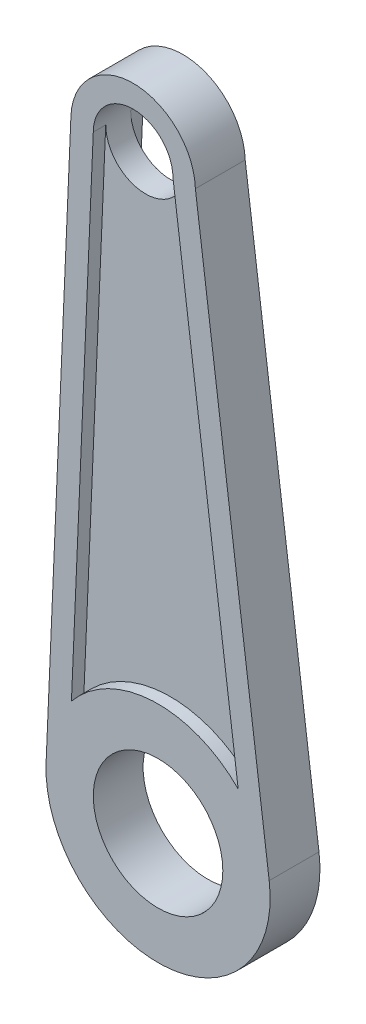
ISO-10303-21;
HEADER;
FILE_DESCRIPTION(('STEP AP214'),'2;1');
FILE_NAME('part.step','',(''),(''),'','','');
FILE_SCHEMA(('AUTOMOTIVE_DESIGN { 1 0 10303 214 1 1 1 1 }'));
ENDSEC;
DATA;
#1=APPLICATION_CONTEXT('core data for automotive mechanical design processes');
#2=APPLICATION_PROTOCOL_DEFINITION('international standard','automotive_design',2000,#1);
#3=PRODUCT_CONTEXT('',#1,'mechanical');
#4=PRODUCT('Part','Part','',(#3));
#5=PRODUCT_RELATED_PRODUCT_CATEGORY('part','',(#4));
#6=PRODUCT_DEFINITION_FORMATION('','',#4);
#7=PRODUCT_DEFINITION_CONTEXT('part definition',#1,'design');
#8=PRODUCT_DEFINITION('design','',#6,#7);
#9=PRODUCT_DEFINITION_SHAPE('','',#8);
#10=(LENGTH_UNIT() NAMED_UNIT(*) SI_UNIT(.MILLI.,.METRE.));
#11=(NAMED_UNIT(*) PLANE_ANGLE_UNIT() SI_UNIT($,.RADIAN.));
#12=(NAMED_UNIT(*) SI_UNIT($,.STERADIAN.) SOLID_ANGLE_UNIT());
#13=UNCERTAINTY_MEASURE_WITH_UNIT(LENGTH_MEASURE(1.E-05),#10,'distance_accuracy_value','');
#14=(GEOMETRIC_REPRESENTATION_CONTEXT(3) GLOBAL_UNCERTAINTY_ASSIGNED_CONTEXT((#13)) GLOBAL_UNIT_ASSIGNED_CONTEXT((#10,
#11,#12)) REPRESENTATION_CONTEXT('',''));
#15=CARTESIAN_POINT('',(0.,0.,0.));
#16=DIRECTION('',(0.,0.,1.));
#17=DIRECTION('',(1.,0.,0.));
#18=AXIS2_PLACEMENT_3D('',#15,#16,#17);
#19=CARTESIAN_POINT('',(14.5457596396694,1.90941631755371,10.));
#20=DIRECTION('',(0.991493917899704,0.130153028270168,0.));
#21=DIRECTION('',(-0.130153028270168,0.991493917899704,0.));
#22=AXIS2_PLACEMENT_3D('',#19,#20,#21);
#23=PLANE('',#22);
#24=DIRECTION('',(0.130153028270168,-0.991493917899704,0.));
#25=VECTOR('',#24,1.);
#26=CARTESIAN_POINT('',(14.5457596396694,1.90941631755371,2.5));
#27=LINE('',#26,#25);
#28=CARTESIAN_POINT('',(8.,51.7744172093779,2.5));
#29=VERTEX_POINT('',#28);
#30=CARTESIAN_POINT('',(21.0831502483952,-47.8918300586089,2.5));
#31=VERTEX_POINT('',#30);
#32=EDGE_CURVE('E235',#29,#31,#27,.T.);
#33=ORIENTED_EDGE('',*,*,#32,.F.);
#34=DIRECTION('',(0.,0.,-1.));
#35=VECTOR('',#34,1.);
#36=CARTESIAN_POINT('',(8.,51.7744172093779,10.));
#37=LINE('',#36,#35);
#38=CARTESIAN_POINT('',(8.,51.7744172093779,0.));
#39=VERTEX_POINT('',#38);
#40=EDGE_CURVE('E101',#29,#39,#37,.T.);
#41=ORIENTED_EDGE('',*,*,#40,.T.);
#42=DIRECTION('',(0.130153028270168,-0.991493917899704,0.));
#43=VECTOR('',#42,1.);
#44=CARTESIAN_POINT('',(14.5457596396694,1.90941631755371,0.));
#45=LINE('',#44,#43);
#46=CARTESIAN_POINT('',(21.0831502483952,-47.8918300586089,0.));
#47=VERTEX_POINT('',#46);
#48=EDGE_CURVE('E182',#39,#47,#45,.T.);
#49=ORIENTED_EDGE('',*,*,#48,.T.);
#50=DIRECTION('',(0.,0.,-1.));
#51=VECTOR('',#50,1.);
#52=CARTESIAN_POINT('',(21.0831502483952,-47.8918300586089,10.));
#53=LINE('',#52,#51);
#54=EDGE_CURVE('E51',#31,#47,#53,.T.);
#55=ORIENTED_EDGE('',*,*,#54,.F.);
#56=EDGE_LOOP('',(#33,#41,#49,#55));
#57=FACE_BOUND('',#56,.T.);
#58=ADVANCED_FACE('F41',(#57),#23,.F.);
#59=CARTESIAN_POINT('',(5.00208599758232,-63.6287094367204,10.));
#60=DIRECTION('',(0.,0.,-1.));
#61=DIRECTION('',(-1.,0.,0.));
#62=AXIS2_PLACEMENT_3D('',#59,#60,#61);
#63=CYLINDRICAL_SURFACE('',#62,22.5);
#64=CARTESIAN_POINT('',(5.00208599758232,-63.6287094367204,2.5));
#65=DIRECTION('',(0.,0.,1.));
#66=DIRECTION('',(1.,0.,0.));
#67=AXIS2_PLACEMENT_3D('',#64,#65,#66);
#68=CIRCLE('',#67,22.5);
#69=CARTESIAN_POINT('',(-12.3878341728911,-49.3514311083917,2.5));
#70=VERTEX_POINT('',#69);
#71=EDGE_CURVE('E228',#31,#70,#68,.T.);
#72=ORIENTED_EDGE('',*,*,#71,.F.);
#73=ORIENTED_EDGE('',*,*,#54,.T.);
#74=CARTESIAN_POINT('',(5.00208599758232,-63.6287094367204,0.));
#75=DIRECTION('',(0.,0.,1.));
#76=DIRECTION('',(1.,0.,0.));
#77=AXIS2_PLACEMENT_3D('',#74,#75,#76);
#78=CIRCLE('',#77,22.5);
#79=CARTESIAN_POINT('',(-12.3878341728911,-49.3514311083917,0.));
#80=VERTEX_POINT('',#79);
#81=EDGE_CURVE('E185',#47,#80,#78,.T.);
#82=ORIENTED_EDGE('',*,*,#81,.T.);
#83=DIRECTION('',(0.,0.,-1.));
#84=VECTOR('',#83,1.);
#85=CARTESIAN_POINT('',(-12.3878341728911,-49.3514311083917,10.));
#86=LINE('',#85,#84);
#87=EDGE_CURVE('E148',#70,#80,#86,.T.);
#88=ORIENTED_EDGE('',*,*,#87,.F.);
#89=EDGE_LOOP('',(#72,#73,#82,#88));
#90=FACE_BOUND('',#89,.T.);
#91=ADVANCED_FACE('F224',(#90),#63,.T.);
#92=CARTESIAN_POINT('',(-10.2272289941798,0.443757808919749,10.));
#93=DIRECTION('',(0.99905998807736,-0.0433490510030528,0.));
#94=DIRECTION('',(0.0433490510030529,0.99905998807736,0.));
#95=AXIS2_PLACEMENT_3D('',#92,#93,#94);
#96=PLANE('',#95);
#97=DIRECTION('',(0.,0.,-1.));
#98=VECTOR('',#97,1.);
#99=CARTESIAN_POINT('',(-8.,51.7744172093779,10.));
#100=LINE('',#99,#98);
#101=CARTESIAN_POINT('',(-8.,51.7744172093779,2.5));
#102=VERTEX_POINT('',#101);
#103=CARTESIAN_POINT('',(-8.,51.7744172093779,0.));
#104=VERTEX_POINT('',#103);
#105=EDGE_CURVE('E200',#102,#104,#100,.T.);
#106=ORIENTED_EDGE('',*,*,#105,.F.);
#107=DIRECTION('',(-0.0433490510030529,-0.99905998807736,0.));
#108=VECTOR('',#107,1.);
#109=CARTESIAN_POINT('',(-10.2272289941798,0.443757808919749,2.5));
#110=LINE('',#109,#108);
#111=EDGE_CURVE('E270',#102,#70,#110,.T.);
#112=ORIENTED_EDGE('',*,*,#111,.T.);
#113=ORIENTED_EDGE('',*,*,#87,.T.);
#114=DIRECTION('',(-0.0433490510030529,-0.99905998807736,0.));
#115=VECTOR('',#114,1.);
#116=CARTESIAN_POINT('',(-10.2272289941798,0.443757808919749,0.));
#117=LINE('',#116,#115);
#118=EDGE_CURVE('E189',#104,#80,#117,.T.);
#119=ORIENTED_EDGE('',*,*,#118,.F.);
#120=EDGE_LOOP('',(#106,#112,#113,#119));
#121=FACE_BOUND('',#120,.T.);
#122=ADVANCED_FACE('F242',(#121),#96,.T.);
#123=CARTESIAN_POINT('',(8.,51.7744172093779,10.));
#124=VERTEX_POINT('',#123);
#125=CARTESIAN_POINT('',(8.,51.7744172093779,7.5));
#126=VERTEX_POINT('',#125);
#127=EDGE_CURVE('E68',#124,#126,#37,.T.);
#128=ORIENTED_EDGE('',*,*,#127,.T.);
#129=DIRECTION('',(0.130153028270168,-0.991493917899704,0.));
#130=VECTOR('',#129,1.);
#131=CARTESIAN_POINT('',(14.5457596396694,1.90941631755371,7.5));
#132=LINE('',#131,#130);
#133=CARTESIAN_POINT('',(21.0831502483952,-47.8918300586089,7.5));
#134=VERTEX_POINT('',#133);
#135=EDGE_CURVE('E257',#126,#134,#132,.T.);
#136=ORIENTED_EDGE('',*,*,#135,.T.);
#137=CARTESIAN_POINT('',(21.0831502483952,-47.8918300586089,10.));
#138=VERTEX_POINT('',#137);
#139=EDGE_CURVE('E11',#138,#134,#53,.T.);
#140=ORIENTED_EDGE('',*,*,#139,.F.);
#141=DIRECTION('',(0.130153028270168,-0.991493917899704,0.));
#142=VECTOR('',#141,1.);
#143=CARTESIAN_POINT('',(14.5457596396694,1.90941631755371,10.));
#144=LINE('',#143,#142);
#145=EDGE_CURVE('E134',#124,#138,#144,.T.);
#146=ORIENTED_EDGE('',*,*,#145,.F.);
#147=EDGE_LOOP('',(#128,#136,#140,#146));
#148=FACE_BOUND('',#147,.T.);
#149=ADVANCED_FACE('F238',(#148),#23,.F.);
#150=ORIENTED_EDGE('',*,*,#139,.T.);
#151=CARTESIAN_POINT('',(5.00208599758232,-63.6287094367204,7.5));
#152=DIRECTION('',(0.,0.,1.));
#153=DIRECTION('',(1.,0.,0.));
#154=AXIS2_PLACEMENT_3D('',#151,#152,#153);
#155=CIRCLE('',#154,22.5);
#156=CARTESIAN_POINT('',(-12.3878341728911,-49.3514311083917,7.5));
#157=VERTEX_POINT('',#156);
#158=EDGE_CURVE('E144',#134,#157,#155,.T.);
#159=ORIENTED_EDGE('',*,*,#158,.T.);
#160=CARTESIAN_POINT('',(-12.3878341728911,-49.3514311083917,10.));
#161=VERTEX_POINT('',#160);
#162=EDGE_CURVE('E141',#161,#157,#86,.T.);
#163=ORIENTED_EDGE('',*,*,#162,.F.);
#164=CARTESIAN_POINT('',(5.00208599758232,-63.6287094367204,10.));
#165=DIRECTION('',(0.,0.,1.));
#166=DIRECTION('',(1.,0.,0.));
#167=AXIS2_PLACEMENT_3D('',#164,#165,#166);
#168=CIRCLE('',#167,22.5);
#169=EDGE_CURVE('E128',#138,#161,#168,.T.);
#170=ORIENTED_EDGE('',*,*,#169,.F.);
#171=EDGE_LOOP('',(#150,#159,#163,#170));
#172=FACE_BOUND('',#171,.T.);
#173=ADVANCED_FACE('F142',(#172),#63,.T.);
#174=DIRECTION('',(-0.0433490510030529,-0.99905998807736,0.));
#175=VECTOR('',#174,1.);
#176=CARTESIAN_POINT('',(-10.2272289941798,0.443757808919749,7.5));
#177=LINE('',#176,#175);
#178=CARTESIAN_POINT('',(-8.,51.7744172093779,7.5));
#179=VERTEX_POINT('',#178);
#180=EDGE_CURVE('E166',#179,#157,#177,.T.);
#181=ORIENTED_EDGE('',*,*,#180,.F.);
#182=CARTESIAN_POINT('',(-8.,51.7744172093779,10.));
#183=VERTEX_POINT('',#182);
#184=EDGE_CURVE('E152',#183,#179,#100,.T.);
#185=ORIENTED_EDGE('',*,*,#184,.F.);
#186=DIRECTION('',(-0.0433490510030529,-0.99905998807736,0.));
#187=VECTOR('',#186,1.);
#188=CARTESIAN_POINT('',(-10.2272289941798,0.443757808919749,10.));
#189=LINE('',#188,#187);
#190=EDGE_CURVE('E133',#183,#161,#189,.T.);
#191=ORIENTED_EDGE('',*,*,#190,.T.);
#192=ORIENTED_EDGE('',*,*,#162,.T.);
#193=EDGE_LOOP('',(#181,#185,#191,#192));
#194=FACE_BOUND('',#193,.T.);
#195=ADVANCED_FACE('F150',(#194),#96,.T.);
#196=CARTESIAN_POINT('',(19.0149383990504,2.4960837079562,10.));
#197=DIRECTION('',(0.991493917899704,0.130153028270168,0.));
#198=DIRECTION('',(-0.130153028270168,0.991493917899704,0.));
#199=AXIS2_PLACEMENT_3D('',#196,#197,#198);
#200=PLANE('',#199);
#201=DIRECTION('',(0.130153028270168,-0.991493917899704,0.));
#202=VECTOR('',#201,1.);
#203=CARTESIAN_POINT('',(19.0149383990504,2.4960837079562,0.));
#204=LINE('',#203,#202);
#205=CARTESIAN_POINT('',(12.4935711762877,52.1752653889079,0.));
#206=VERTEX_POINT('',#205);
#207=CARTESIAN_POINT('',(27.3106991503257,-60.7002663006416,0.));
#208=VERTEX_POINT('',#207);
#209=EDGE_CURVE('E165',#206,#208,#204,.T.);
#210=ORIENTED_EDGE('',*,*,#209,.F.);
#211=DIRECTION('',(0.,0.,-1.));
#212=VECTOR('',#211,1.);
#213=CARTESIAN_POINT('',(12.4935711762877,52.1752653889079,10.));
#214=LINE('',#213,#212);
#215=CARTESIAN_POINT('',(12.4935711762877,52.1752653889079,10.));
#216=VERTEX_POINT('',#215);
#217=EDGE_CURVE('E45',#216,#206,#214,.T.);
#218=ORIENTED_EDGE('',*,*,#217,.F.);
#219=DIRECTION('',(0.130153028270168,-0.991493917899704,0.));
#220=VECTOR('',#219,1.);
#221=CARTESIAN_POINT('',(19.0149383990504,2.4960837079562,10.));
#222=LINE('',#221,#220);
#223=CARTESIAN_POINT('',(27.3106991503257,-60.7002663006416,10.));
#224=VERTEX_POINT('',#223);
#225=EDGE_CURVE('E285',#216,#224,#222,.T.);
#226=ORIENTED_EDGE('',*,*,#225,.T.);
#227=DIRECTION('',(0.,0.,-1.));
#228=VECTOR('',#227,1.);
#229=CARTESIAN_POINT('',(27.3106991503257,-60.7002663006416,10.));
#230=LINE('',#229,#228);
#231=EDGE_CURVE('E157',#224,#208,#230,.T.);
#232=ORIENTED_EDGE('',*,*,#231,.T.);
#233=EDGE_LOOP('',(#210,#218,#226,#232));
#234=FACE_BOUND('',#233,.T.);
#235=ADVANCED_FACE('F324',(#234),#200,.T.);
#236=CARTESIAN_POINT('',(0.,51.7744172093779,10.));
#237=DIRECTION('',(0.,0.,-1.));
#238=DIRECTION('',(-1.,0.,0.));
#239=AXIS2_PLACEMENT_3D('',#236,#237,#238);
#240=CYLINDRICAL_SURFACE('',#239,12.5);
#241=CARTESIAN_POINT('',(0.,51.7744172093779,0.));
#242=DIRECTION('',(0.,0.,1.));
#243=DIRECTION('',(1.,0.,0.));
#244=AXIS2_PLACEMENT_3D('',#241,#242,#243);
#245=CIRCLE('',#244,12.5);
#246=CARTESIAN_POINT('',(-12.488249850967,52.316280346916,0.));
#247=VERTEX_POINT('',#246);
#248=EDGE_CURVE('E170',#206,#247,#245,.T.);
#249=ORIENTED_EDGE('',*,*,#248,.T.);
#250=DIRECTION('',(0.,0.,-1.));
#251=VECTOR('',#250,1.);
#252=CARTESIAN_POINT('',(-12.488249850967,52.316280346916,10.));
#253=LINE('',#252,#251);
#254=CARTESIAN_POINT('',(-12.488249850967,52.316280346916,10.));
#255=VERTEX_POINT('',#254);
#256=EDGE_CURVE('E208',#255,#247,#253,.T.);
#257=ORIENTED_EDGE('',*,*,#256,.F.);
#258=CARTESIAN_POINT('',(0.,51.7744172093779,10.));
#259=DIRECTION('',(0.,0.,1.));
#260=DIRECTION('',(1.,0.,0.));
#261=AXIS2_PLACEMENT_3D('',#258,#259,#260);
#262=CIRCLE('',#261,12.5);
#263=EDGE_CURVE('E288',#216,#255,#262,.T.);
#264=ORIENTED_EDGE('',*,*,#263,.F.);
#265=ORIENTED_EDGE('',*,*,#217,.T.);
#266=EDGE_LOOP('',(#249,#257,#264,#265));
#267=FACE_BOUND('',#266,.T.);
#268=ADVANCED_FACE('F328',(#267),#240,.T.);
#269=CARTESIAN_POINT('',(-14.7305119669297,0.63915452743171,10.));
#270=DIRECTION('',(0.99905998807736,-0.0433490510030528,0.));
#271=DIRECTION('',(0.0433490510030528,0.99905998807736,0.));
#272=AXIS2_PLACEMENT_3D('',#269,#270,#271);
#273=PLANE('',#272);
#274=DIRECTION('',(-0.0433490510030528,-0.99905998807736,0.));
#275=VECTOR('',#274,1.);
#276=CARTESIAN_POINT('',(-14.7305119669297,0.63915452743171,0.));
#277=LINE('',#276,#275);
#278=CARTESIAN_POINT('',(-17.4767637341583,-62.6533557891517,0.));
#279=VERTEX_POINT('',#278);
#280=EDGE_CURVE('E174',#247,#279,#277,.T.);
#281=ORIENTED_EDGE('',*,*,#280,.T.);
#282=DIRECTION('',(0.,0.,-1.));
#283=VECTOR('',#282,1.);
#284=CARTESIAN_POINT('',(-17.4767637341583,-62.6533557891517,10.));
#285=LINE('',#284,#283);
#286=CARTESIAN_POINT('',(-17.4767637341583,-62.6533557891517,10.));
#287=VERTEX_POINT('',#286);
#288=EDGE_CURVE('E205',#287,#279,#285,.T.);
#289=ORIENTED_EDGE('',*,*,#288,.F.);
#290=DIRECTION('',(-0.0433490510030528,-0.99905998807736,0.));
#291=VECTOR('',#290,1.);
#292=CARTESIAN_POINT('',(-14.7305119669297,0.63915452743171,10.));
#293=LINE('',#292,#291);
#294=EDGE_CURVE('E292',#255,#287,#293,.T.);
#295=ORIENTED_EDGE('',*,*,#294,.F.);
#296=ORIENTED_EDGE('',*,*,#256,.T.);
#297=EDGE_LOOP('',(#281,#289,#295,#296));
#298=FACE_BOUND('',#297,.T.);
#299=ADVANCED_FACE('F332',(#298),#273,.F.);
#300=CARTESIAN_POINT('',(5.00208599758232,-63.6287094367204,10.));
#301=DIRECTION('',(0.,0.,-1.));
#302=DIRECTION('',(-1.,0.,0.));
#303=AXIS2_PLACEMENT_3D('',#300,#301,#302);
#304=CYLINDRICAL_SURFACE('',#303,22.5);
#305=CARTESIAN_POINT('',(5.00208599758232,-63.6287094367204,0.));
#306=DIRECTION('',(0.,0.,1.));
#307=DIRECTION('',(1.,0.,0.));
#308=AXIS2_PLACEMENT_3D('',#305,#306,#307);
#309=CIRCLE('',#308,22.5);
#310=EDGE_CURVE('E178',#279,#208,#309,.T.);
#311=ORIENTED_EDGE('',*,*,#310,.T.);
#312=ORIENTED_EDGE('',*,*,#231,.F.);
#313=CARTESIAN_POINT('',(5.00208599758232,-63.6287094367204,10.));
#314=DIRECTION('',(0.,0.,1.));
#315=DIRECTION('',(1.,0.,0.));
#316=AXIS2_PLACEMENT_3D('',#313,#314,#315);
#317=CIRCLE('',#316,22.5);
#318=EDGE_CURVE('E296',#287,#224,#317,.T.);
#319=ORIENTED_EDGE('',*,*,#318,.F.);
#320=ORIENTED_EDGE('',*,*,#288,.T.);
#321=EDGE_LOOP('',(#311,#312,#319,#320));
#322=FACE_BOUND('',#321,.T.);
#323=ADVANCED_FACE('F336',(#322),#304,.T.);
#324=CARTESIAN_POINT('',(5.00208599758232,-63.6287094367204,10.));
#325=DIRECTION('',(0.,0.,-1.));
#326=DIRECTION('',(-1.,0.,0.));
#327=AXIS2_PLACEMENT_3D('',#324,#325,#326);
#328=CYLINDRICAL_SURFACE('',#327,13.);
#329=CARTESIAN_POINT('',(5.00208599758232,-63.6287094367204,10.));
#330=DIRECTION('',(0.,0.,1.));
#331=DIRECTION('',(1.,0.,0.));
#332=AXIS2_PLACEMENT_3D('',#329,#330,#331);
#333=CIRCLE('',#332,13.);
#334=CARTESIAN_POINT('',(18.0020859975823,-63.6287094367204,10.));
#335=VERTEX_POINT('',#334);
#336=EDGE_CURVE('E197',#335,#335,#333,.T.);
#337=ORIENTED_EDGE('',*,*,#336,.T.);
#338=EDGE_LOOP('',(#337));
#339=FACE_BOUND('',#338,.T.);
#340=CARTESIAN_POINT('',(5.00208599758232,-63.6287094367204,0.));
#341=DIRECTION('',(0.,0.,1.));
#342=DIRECTION('',(1.,0.,0.));
#343=AXIS2_PLACEMENT_3D('',#340,#341,#342);
#344=CIRCLE('',#343,13.);
#345=CARTESIAN_POINT('',(18.0020859975823,-63.6287094367204,0.));
#346=VERTEX_POINT('',#345);
#347=EDGE_CURVE('E161',#346,#346,#344,.T.);
#348=ORIENTED_EDGE('',*,*,#347,.F.);
#349=EDGE_LOOP('',(#348));
#350=FACE_BOUND('',#349,.T.);
#351=ADVANCED_FACE('F43',(#339,#350),#328,.F.);
#352=CARTESIAN_POINT('',(0.,51.7744172093779,10.));
#353=DIRECTION('',(0.,0.,-1.));
#354=DIRECTION('',(-1.,0.,0.));
#355=AXIS2_PLACEMENT_3D('',#352,#353,#354);
#356=CYLINDRICAL_SURFACE('',#355,8.);
#357=ORIENTED_EDGE('',*,*,#40,.F.);
#358=CARTESIAN_POINT('',(0.,51.7744172093779,2.5));
#359=DIRECTION('',(0.,0.,1.));
#360=DIRECTION('',(1.,0.,0.));
#361=AXIS2_PLACEMENT_3D('',#358,#359,#360);
#362=CIRCLE('',#361,8.);
#363=EDGE_CURVE('E59',#102,#29,#362,.T.);
#364=ORIENTED_EDGE('',*,*,#363,.F.);
#365=ORIENTED_EDGE('',*,*,#105,.T.);
#366=CARTESIAN_POINT('',(0.,51.7744172093779,0.));
#367=DIRECTION('',(0.,0.,1.));
#368=DIRECTION('',(1.,0.,0.));
#369=AXIS2_PLACEMENT_3D('',#366,#367,#368);
#370=CIRCLE('',#369,8.);
#371=EDGE_CURVE('E193',#39,#104,#370,.T.);
#372=ORIENTED_EDGE('',*,*,#371,.F.);
#373=EDGE_LOOP('',(#357,#364,#365,#372));
#374=FACE_BOUND('',#373,.T.);
#375=CARTESIAN_POINT('',(0.,51.7744172093779,7.5));
#376=DIRECTION('',(0.,0.,1.));
#377=DIRECTION('',(1.,0.,0.));
#378=AXIS2_PLACEMENT_3D('',#375,#376,#377);
#379=CIRCLE('',#378,8.);
#380=EDGE_CURVE('E301',#179,#126,#379,.T.);
#381=ORIENTED_EDGE('',*,*,#380,.T.);
#382=ORIENTED_EDGE('',*,*,#127,.F.);
#383=CARTESIAN_POINT('',(0.,51.7744172093779,10.));
#384=DIRECTION('',(0.,0.,1.));
#385=DIRECTION('',(1.,0.,0.));
#386=AXIS2_PLACEMENT_3D('',#383,#384,#385);
#387=CIRCLE('',#386,8.);
#388=EDGE_CURVE('E154',#124,#183,#387,.T.);
#389=ORIENTED_EDGE('',*,*,#388,.T.);
#390=ORIENTED_EDGE('',*,*,#184,.T.);
#391=EDGE_LOOP('',(#381,#382,#389,#390));
#392=FACE_BOUND('',#391,.T.);
#393=ADVANCED_FACE('F307',(#374,#392),#356,.F.);
#394=CARTESIAN_POINT('',(0.,0.,10.));
#395=DIRECTION('',(0.,0.,1.));
#396=DIRECTION('',(1.,0.,0.));
#397=AXIS2_PLACEMENT_3D('',#394,#395,#396);
#398=PLANE('',#397);
#399=ORIENTED_EDGE('',*,*,#336,.F.);
#400=EDGE_LOOP('',(#399));
#401=FACE_BOUND('',#400,.T.);
#402=ORIENTED_EDGE('',*,*,#225,.F.);
#403=ORIENTED_EDGE('',*,*,#263,.T.);
#404=ORIENTED_EDGE('',*,*,#294,.T.);
#405=ORIENTED_EDGE('',*,*,#318,.T.);
#406=EDGE_LOOP('',(#402,#403,#404,#405));
#407=FACE_BOUND('',#406,.T.);
#408=ORIENTED_EDGE('',*,*,#145,.T.);
#409=ORIENTED_EDGE('',*,*,#169,.T.);
#410=ORIENTED_EDGE('',*,*,#190,.F.);
#411=ORIENTED_EDGE('',*,*,#388,.F.);
#412=EDGE_LOOP('',(#408,#409,#410,#411));
#413=FACE_BOUND('',#412,.T.);
#414=ADVANCED_FACE('F130',(#401,#407,#413),#398,.T.);
#415=CARTESIAN_POINT('',(0.,0.,0.));
#416=DIRECTION('',(0.,0.,1.));
#417=DIRECTION('',(1.,0.,0.));
#418=AXIS2_PLACEMENT_3D('',#415,#416,#417);
#419=PLANE('',#418);
#420=ORIENTED_EDGE('',*,*,#347,.T.);
#421=EDGE_LOOP('',(#420));
#422=FACE_BOUND('',#421,.T.);
#423=ORIENTED_EDGE('',*,*,#209,.T.);
#424=ORIENTED_EDGE('',*,*,#310,.F.);
#425=ORIENTED_EDGE('',*,*,#280,.F.);
#426=ORIENTED_EDGE('',*,*,#248,.F.);
#427=EDGE_LOOP('',(#423,#424,#425,#426));
#428=FACE_BOUND('',#427,.T.);
#429=ORIENTED_EDGE('',*,*,#48,.F.);
#430=ORIENTED_EDGE('',*,*,#371,.T.);
#431=ORIENTED_EDGE('',*,*,#118,.T.);
#432=ORIENTED_EDGE('',*,*,#81,.F.);
#433=EDGE_LOOP('',(#429,#430,#431,#432));
#434=FACE_BOUND('',#433,.T.);
#435=ADVANCED_FACE('F230',(#422,#428,#434),#419,.F.);
#436=CARTESIAN_POINT('',(0.,0.,7.5));
#437=DIRECTION('',(0.,0.,1.));
#438=DIRECTION('',(1.,0.,0.));
#439=AXIS2_PLACEMENT_3D('',#436,#437,#438);
#440=PLANE('',#439);
#441=ORIENTED_EDGE('',*,*,#158,.F.);
#442=ORIENTED_EDGE('',*,*,#135,.F.);
#443=ORIENTED_EDGE('',*,*,#380,.F.);
#444=ORIENTED_EDGE('',*,*,#180,.T.);
#445=EDGE_LOOP('',(#441,#442,#443,#444));
#446=FACE_BOUND('',#445,.T.);
#447=ADVANCED_FACE('F308',(#446),#440,.T.);
#448=CARTESIAN_POINT('',(0.,0.,2.5));
#449=DIRECTION('',(0.,0.,1.));
#450=DIRECTION('',(1.,0.,0.));
#451=AXIS2_PLACEMENT_3D('',#448,#449,#450);
#452=PLANE('',#451);
#453=ORIENTED_EDGE('',*,*,#71,.T.);
#454=ORIENTED_EDGE('',*,*,#111,.F.);
#455=ORIENTED_EDGE('',*,*,#363,.T.);
#456=ORIENTED_EDGE('',*,*,#32,.T.);
#457=EDGE_LOOP('',(#453,#454,#455,#456));
#458=FACE_BOUND('',#457,.T.);
#459=ADVANCED_FACE('F269',(#458),#452,.F.);
#460=CLOSED_SHELL('',(#58,#91,#122,#149,#173,#195,#235,#268,#299,#323,#351,#393,#414,#435,#447,#459));
#461=MANIFOLD_SOLID_BREP('B2',#460);
#462=ADVANCED_BREP_SHAPE_REPRESENTATION('',(#18,#461),#14);
#463=SHAPE_DEFINITION_REPRESENTATION(#9,#462);
ENDSEC;
END-ISO-10303-21;
